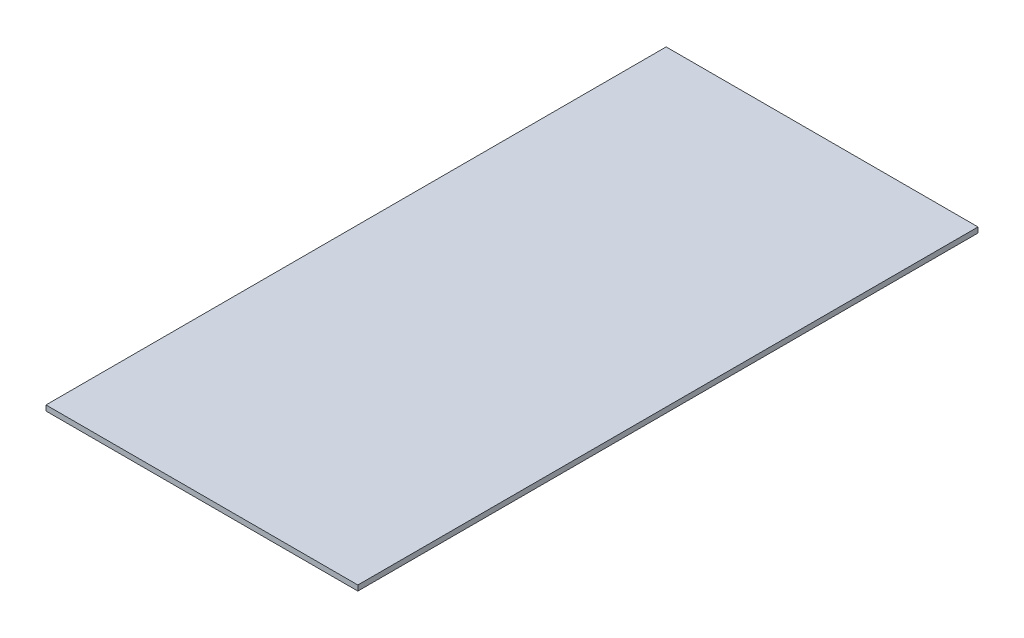
ISO-10303-21;
HEADER;
FILE_DESCRIPTION(('STEP AP214'),'2;1');
FILE_NAME('part.step','',(''),(''),'','','');
FILE_SCHEMA(('AUTOMOTIVE_DESIGN { 1 0 10303 214 1 1 1 1 }'));
ENDSEC;
DATA;
#1=APPLICATION_CONTEXT('core data for automotive mechanical design processes');
#2=APPLICATION_PROTOCOL_DEFINITION('international standard','automotive_design',2000,#1);
#3=PRODUCT_CONTEXT('',#1,'mechanical');
#4=PRODUCT('Part','Part','',(#3));
#5=PRODUCT_RELATED_PRODUCT_CATEGORY('part','',(#4));
#6=PRODUCT_DEFINITION_FORMATION('','',#4);
#7=PRODUCT_DEFINITION_CONTEXT('part definition',#1,'design');
#8=PRODUCT_DEFINITION('design','',#6,#7);
#9=PRODUCT_DEFINITION_SHAPE('','',#8);
#10=(LENGTH_UNIT() NAMED_UNIT(*) SI_UNIT(.MILLI.,.METRE.));
#11=(NAMED_UNIT(*) PLANE_ANGLE_UNIT() SI_UNIT($,.RADIAN.));
#12=(NAMED_UNIT(*) SI_UNIT($,.STERADIAN.) SOLID_ANGLE_UNIT());
#13=UNCERTAINTY_MEASURE_WITH_UNIT(LENGTH_MEASURE(1.E-05),#10,'distance_accuracy_value','');
#14=(GEOMETRIC_REPRESENTATION_CONTEXT(3) GLOBAL_UNCERTAINTY_ASSIGNED_CONTEXT((#13)) GLOBAL_UNIT_ASSIGNED_CONTEXT((#10,
#11,#12)) REPRESENTATION_CONTEXT('',''));
#15=CARTESIAN_POINT('',(0.,0.,0.));
#16=DIRECTION('',(0.,0.,1.));
#17=DIRECTION('',(1.,0.,0.));
#18=AXIS2_PLACEMENT_3D('',#15,#16,#17);
#19=CARTESIAN_POINT('',(0.,3.,0.));
#20=DIRECTION('',(1.,0.,0.));
#21=DIRECTION('',(0.,0.,-1.));
#22=AXIS2_PLACEMENT_3D('',#19,#20,#21);
#23=PLANE('',#22);
#24=DIRECTION('',(0.,0.,1.));
#25=VECTOR('',#24,1.);
#26=CARTESIAN_POINT('',(0.,0.,0.));
#27=LINE('',#26,#25);
#28=CARTESIAN_POINT('',(0.,0.,-350.));
#29=VERTEX_POINT('',#28);
#30=CARTESIAN_POINT('',(0.,0.,0.));
#31=VERTEX_POINT('',#30);
#32=EDGE_CURVE('E107',#29,#31,#27,.T.);
#33=ORIENTED_EDGE('',*,*,#32,.T.);
#34=DIRECTION('',(0.,-1.,0.));
#35=VECTOR('',#34,1.);
#36=CARTESIAN_POINT('',(0.,3.,0.));
#37=LINE('',#36,#35);
#38=CARTESIAN_POINT('',(0.,3.,0.));
#39=VERTEX_POINT('',#38);
#40=EDGE_CURVE('E11',#39,#31,#37,.T.);
#41=ORIENTED_EDGE('',*,*,#40,.F.);
#42=DIRECTION('',(0.,0.,1.));
#43=VECTOR('',#42,1.);
#44=CARTESIAN_POINT('',(0.,3.,0.));
#45=LINE('',#44,#43);
#46=CARTESIAN_POINT('',(0.,3.,-350.));
#47=VERTEX_POINT('',#46);
#48=EDGE_CURVE('E91',#47,#39,#45,.T.);
#49=ORIENTED_EDGE('',*,*,#48,.F.);
#50=DIRECTION('',(0.,-1.,0.));
#51=VECTOR('',#50,1.);
#52=CARTESIAN_POINT('',(0.,3.,-350.));
#53=LINE('',#52,#51);
#54=EDGE_CURVE('E103',#47,#29,#53,.T.);
#55=ORIENTED_EDGE('',*,*,#54,.T.);
#56=EDGE_LOOP('',(#33,#41,#49,#55));
#57=FACE_BOUND('',#56,.T.);
#58=ADVANCED_FACE('F39',(#57),#23,.F.);
#59=CARTESIAN_POINT('',(0.,3.,0.));
#60=DIRECTION('',(0.,0.,-1.));
#61=DIRECTION('',(-1.,0.,0.));
#62=AXIS2_PLACEMENT_3D('',#59,#60,#61);
#63=PLANE('',#62);
#64=DIRECTION('',(1.,0.,0.));
#65=VECTOR('',#64,1.);
#66=CARTESIAN_POINT('',(0.,0.,0.));
#67=LINE('',#66,#65);
#68=CARTESIAN_POINT('',(176.,0.,0.));
#69=VERTEX_POINT('',#68);
#70=EDGE_CURVE('E96',#31,#69,#67,.T.);
#71=ORIENTED_EDGE('',*,*,#70,.T.);
#72=DIRECTION('',(0.,-1.,0.));
#73=VECTOR('',#72,1.);
#74=CARTESIAN_POINT('',(176.,3.,0.));
#75=LINE('',#74,#73);
#76=CARTESIAN_POINT('',(176.,3.,0.));
#77=VERTEX_POINT('',#76);
#78=EDGE_CURVE('E48',#77,#69,#75,.T.);
#79=ORIENTED_EDGE('',*,*,#78,.F.);
#80=DIRECTION('',(1.,0.,0.));
#81=VECTOR('',#80,1.);
#82=CARTESIAN_POINT('',(0.,3.,0.));
#83=LINE('',#82,#81);
#84=EDGE_CURVE('E86',#39,#77,#83,.T.);
#85=ORIENTED_EDGE('',*,*,#84,.F.);
#86=ORIENTED_EDGE('',*,*,#40,.T.);
#87=EDGE_LOOP('',(#71,#79,#85,#86));
#88=FACE_BOUND('',#87,.T.);
#89=ADVANCED_FACE('F95',(#88),#63,.F.);
#90=CARTESIAN_POINT('',(176.,3.,0.));
#91=DIRECTION('',(-1.,0.,0.));
#92=DIRECTION('',(0.,0.,1.));
#93=AXIS2_PLACEMENT_3D('',#90,#91,#92);
#94=PLANE('',#93);
#95=DIRECTION('',(0.,0.,-1.));
#96=VECTOR('',#95,1.);
#97=CARTESIAN_POINT('',(176.,0.,0.));
#98=LINE('',#97,#96);
#99=CARTESIAN_POINT('',(176.,0.,-350.));
#100=VERTEX_POINT('',#99);
#101=EDGE_CURVE('E73',#69,#100,#98,.T.);
#102=ORIENTED_EDGE('',*,*,#101,.T.);
#103=DIRECTION('',(0.,-1.,0.));
#104=VECTOR('',#103,1.);
#105=CARTESIAN_POINT('',(176.,3.,-350.));
#106=LINE('',#105,#104);
#107=CARTESIAN_POINT('',(176.,3.,-350.));
#108=VERTEX_POINT('',#107);
#109=EDGE_CURVE('E98',#108,#100,#106,.T.);
#110=ORIENTED_EDGE('',*,*,#109,.F.);
#111=DIRECTION('',(0.,0.,-1.));
#112=VECTOR('',#111,1.);
#113=CARTESIAN_POINT('',(176.,3.,0.));
#114=LINE('',#113,#112);
#115=EDGE_CURVE('E89',#77,#108,#114,.T.);
#116=ORIENTED_EDGE('',*,*,#115,.F.);
#117=ORIENTED_EDGE('',*,*,#78,.T.);
#118=EDGE_LOOP('',(#102,#110,#116,#117));
#119=FACE_BOUND('',#118,.T.);
#120=ADVANCED_FACE('F99',(#119),#94,.F.);
#121=CARTESIAN_POINT('',(0.,3.,-350.));
#122=DIRECTION('',(0.,0.,1.));
#123=DIRECTION('',(1.,0.,0.));
#124=AXIS2_PLACEMENT_3D('',#121,#122,#123);
#125=PLANE('',#124);
#126=DIRECTION('',(-1.,0.,0.));
#127=VECTOR('',#126,1.);
#128=CARTESIAN_POINT('',(0.,0.,-350.));
#129=LINE('',#128,#127);
#130=EDGE_CURVE('E79',#100,#29,#129,.T.);
#131=ORIENTED_EDGE('',*,*,#130,.T.);
#132=ORIENTED_EDGE('',*,*,#54,.F.);
#133=DIRECTION('',(-1.,0.,0.));
#134=VECTOR('',#133,1.);
#135=CARTESIAN_POINT('',(0.,3.,-350.));
#136=LINE('',#135,#134);
#137=EDGE_CURVE('E56',#108,#47,#136,.T.);
#138=ORIENTED_EDGE('',*,*,#137,.F.);
#139=ORIENTED_EDGE('',*,*,#109,.T.);
#140=EDGE_LOOP('',(#131,#132,#138,#139));
#141=FACE_BOUND('',#140,.T.);
#142=ADVANCED_FACE('F120',(#141),#125,.F.);
#143=CARTESIAN_POINT('',(0.,3.,0.));
#144=DIRECTION('',(0.,-1.,0.));
#145=DIRECTION('',(0.,0.,-1.));
#146=AXIS2_PLACEMENT_3D('',#143,#144,#145);
#147=PLANE('',#146);
#148=ORIENTED_EDGE('',*,*,#48,.T.);
#149=ORIENTED_EDGE('',*,*,#84,.T.);
#150=ORIENTED_EDGE('',*,*,#115,.T.);
#151=ORIENTED_EDGE('',*,*,#137,.T.);
#152=EDGE_LOOP('',(#148,#149,#150,#151));
#153=FACE_BOUND('',#152,.T.);
#154=ADVANCED_FACE('F87',(#153),#147,.F.);
#155=CARTESIAN_POINT('',(0.,0.,0.));
#156=DIRECTION('',(0.,-1.,0.));
#157=DIRECTION('',(0.,0.,-1.));
#158=AXIS2_PLACEMENT_3D('',#155,#156,#157);
#159=PLANE('',#158);
#160=ORIENTED_EDGE('',*,*,#32,.F.);
#161=ORIENTED_EDGE('',*,*,#130,.F.);
#162=ORIENTED_EDGE('',*,*,#101,.F.);
#163=ORIENTED_EDGE('',*,*,#70,.F.);
#164=EDGE_LOOP('',(#160,#161,#162,#163));
#165=FACE_BOUND('',#164,.T.);
#166=ADVANCED_FACE('F123',(#165),#159,.T.);
#167=CLOSED_SHELL('',(#58,#89,#120,#142,#154,#166));
#168=MANIFOLD_SOLID_BREP('B2',#167);
#169=ADVANCED_BREP_SHAPE_REPRESENTATION('',(#18,#168),#14);
#170=SHAPE_DEFINITION_REPRESENTATION(#9,#169);
ENDSEC;
END-ISO-10303-21;
